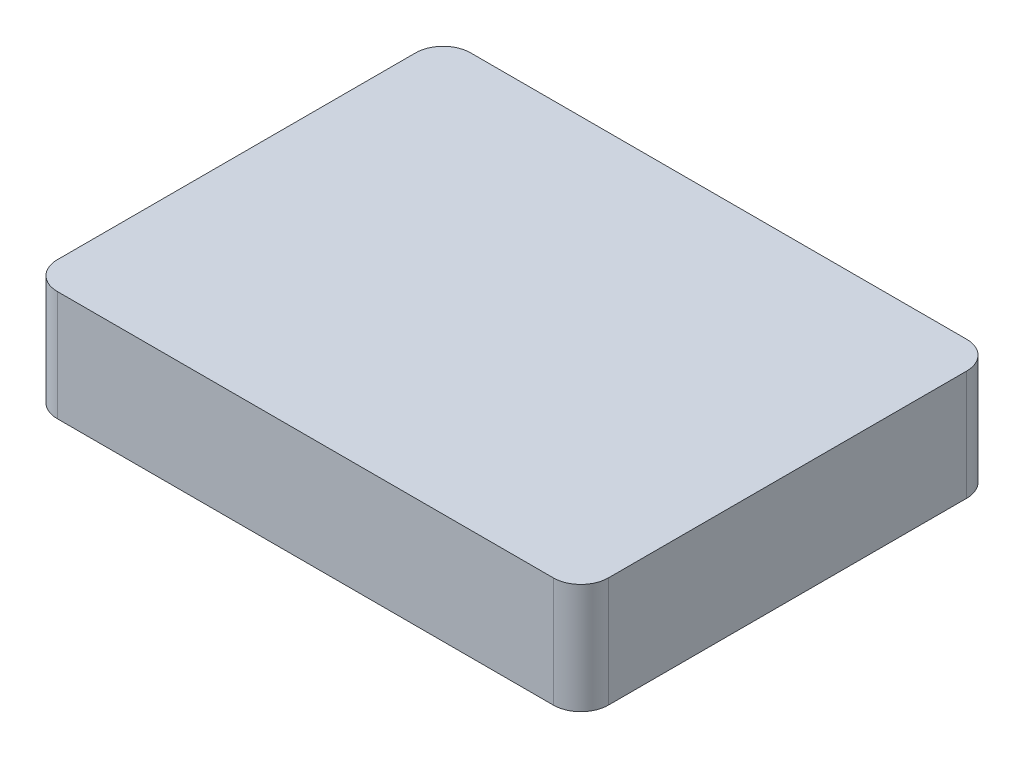
ISO-10303-21;
HEADER;
FILE_DESCRIPTION(('STEP AP214'),'2;1');
FILE_NAME('part.step','',(''),(''),'','','');
FILE_SCHEMA(('AUTOMOTIVE_DESIGN { 1 0 10303 214 1 1 1 1 }'));
ENDSEC;
DATA;
#1=APPLICATION_CONTEXT('core data for automotive mechanical design processes');
#2=APPLICATION_PROTOCOL_DEFINITION('international standard','automotive_design',2000,#1);
#3=PRODUCT_CONTEXT('',#1,'mechanical');
#4=PRODUCT('Part','Part','',(#3));
#5=PRODUCT_RELATED_PRODUCT_CATEGORY('part','',(#4));
#6=PRODUCT_DEFINITION_FORMATION('','',#4);
#7=PRODUCT_DEFINITION_CONTEXT('part definition',#1,'design');
#8=PRODUCT_DEFINITION('design','',#6,#7);
#9=PRODUCT_DEFINITION_SHAPE('','',#8);
#10=(LENGTH_UNIT() NAMED_UNIT(*) SI_UNIT(.MILLI.,.METRE.));
#11=(NAMED_UNIT(*) PLANE_ANGLE_UNIT() SI_UNIT($,.RADIAN.));
#12=(NAMED_UNIT(*) SI_UNIT($,.STERADIAN.) SOLID_ANGLE_UNIT());
#13=UNCERTAINTY_MEASURE_WITH_UNIT(LENGTH_MEASURE(1.E-05),#10,'distance_accuracy_value','');
#14=(GEOMETRIC_REPRESENTATION_CONTEXT(3) GLOBAL_UNCERTAINTY_ASSIGNED_CONTEXT((#13)) GLOBAL_UNIT_ASSIGNED_CONTEXT((#10,
#11,#12)) REPRESENTATION_CONTEXT('',''));
#15=CARTESIAN_POINT('',(0.,0.,0.));
#16=DIRECTION('',(0.,0.,1.));
#17=DIRECTION('',(1.,0.,0.));
#18=AXIS2_PLACEMENT_3D('',#15,#16,#17);
#19=CARTESIAN_POINT('',(0.,2.54,-9.525));
#20=DIRECTION('',(1.,0.,0.));
#21=DIRECTION('',(0.,0.,-1.));
#22=AXIS2_PLACEMENT_3D('',#19,#20,#21);
#23=PLANE('',#22);
#24=DIRECTION('',(0.,0.,1.));
#25=VECTOR('',#24,1.);
#26=CARTESIAN_POINT('',(0.,2.54,-9.525));
#27=LINE('',#26,#25);
#28=CARTESIAN_POINT('',(0.,2.54,-8.89));
#29=VERTEX_POINT('',#28);
#30=CARTESIAN_POINT('',(0.,2.54,-0.635000000000004));
#31=VERTEX_POINT('',#30);
#32=EDGE_CURVE('E161',#29,#31,#27,.T.);
#33=ORIENTED_EDGE('',*,*,#32,.F.);
#34=DIRECTION('',(0.,-1.,0.));
#35=VECTOR('',#34,1.);
#36=CARTESIAN_POINT('',(0.,2.54,-8.89));
#37=LINE('',#36,#35);
#38=CARTESIAN_POINT('',(0.,0.,-8.89));
#39=VERTEX_POINT('',#38);
#40=EDGE_CURVE('E186',#29,#39,#37,.T.);
#41=ORIENTED_EDGE('',*,*,#40,.T.);
#42=DIRECTION('',(0.,0.,1.));
#43=VECTOR('',#42,1.);
#44=CARTESIAN_POINT('',(0.,0.,-9.525));
#45=LINE('',#44,#43);
#46=CARTESIAN_POINT('',(0.,0.,-0.635000000000004));
#47=VERTEX_POINT('',#46);
#48=EDGE_CURVE('E174',#39,#47,#45,.T.);
#49=ORIENTED_EDGE('',*,*,#48,.T.);
#50=DIRECTION('',(0.,-1.,0.));
#51=VECTOR('',#50,1.);
#52=CARTESIAN_POINT('',(0.,2.54,-0.635));
#53=LINE('',#52,#51);
#54=EDGE_CURVE('E173',#47,#31,#53,.F.);
#55=ORIENTED_EDGE('',*,*,#54,.T.);
#56=EDGE_LOOP('',(#33,#41,#49,#55));
#57=FACE_BOUND('',#56,.T.);
#58=ADVANCED_FACE('F32',(#57),#23,.F.);
#59=CARTESIAN_POINT('',(0.,2.54,0.));
#60=DIRECTION('',(0.,0.,-1.));
#61=DIRECTION('',(-1.,0.,0.));
#62=AXIS2_PLACEMENT_3D('',#59,#60,#61);
#63=PLANE('',#62);
#64=DIRECTION('',(1.,0.,0.));
#65=VECTOR('',#64,1.);
#66=CARTESIAN_POINT('',(0.,0.,0.));
#67=LINE('',#66,#65);
#68=CARTESIAN_POINT('',(0.635,0.,0.));
#69=VERTEX_POINT('',#68);
#70=CARTESIAN_POINT('',(12.065,0.,0.));
#71=VERTEX_POINT('',#70);
#72=EDGE_CURVE('E177',#69,#71,#67,.T.);
#73=ORIENTED_EDGE('',*,*,#72,.T.);
#74=DIRECTION('',(0.,-1.,0.));
#75=VECTOR('',#74,1.);
#76=CARTESIAN_POINT('',(12.065,2.54,0.));
#77=LINE('',#76,#75);
#78=CARTESIAN_POINT('',(12.065,2.54,0.));
#79=VERTEX_POINT('',#78);
#80=EDGE_CURVE('E40',#71,#79,#77,.F.);
#81=ORIENTED_EDGE('',*,*,#80,.T.);
#82=DIRECTION('',(1.,0.,0.));
#83=VECTOR('',#82,1.);
#84=CARTESIAN_POINT('',(0.,2.54,0.));
#85=LINE('',#84,#83);
#86=CARTESIAN_POINT('',(0.635,2.54,0.));
#87=VERTEX_POINT('',#86);
#88=EDGE_CURVE('E164',#87,#79,#85,.T.);
#89=ORIENTED_EDGE('',*,*,#88,.F.);
#90=DIRECTION('',(0.,-1.,0.));
#91=VECTOR('',#90,1.);
#92=CARTESIAN_POINT('',(0.635,2.54,0.));
#93=LINE('',#92,#91);
#94=EDGE_CURVE('E214',#87,#69,#93,.T.);
#95=ORIENTED_EDGE('',*,*,#94,.T.);
#96=EDGE_LOOP('',(#73,#81,#89,#95));
#97=FACE_BOUND('',#96,.T.);
#98=ADVANCED_FACE('F219',(#97),#63,.F.);
#99=CARTESIAN_POINT('',(12.7,2.54,0.));
#100=DIRECTION('',(-1.,0.,0.));
#101=DIRECTION('',(0.,0.,1.));
#102=AXIS2_PLACEMENT_3D('',#99,#100,#101);
#103=PLANE('',#102);
#104=DIRECTION('',(0.,0.,-1.));
#105=VECTOR('',#104,1.);
#106=CARTESIAN_POINT('',(12.7,0.,0.));
#107=LINE('',#106,#105);
#108=CARTESIAN_POINT('',(12.7,0.,-0.635));
#109=VERTEX_POINT('',#108);
#110=CARTESIAN_POINT('',(12.7,0.,-8.89));
#111=VERTEX_POINT('',#110);
#112=EDGE_CURVE('E181',#109,#111,#107,.T.);
#113=ORIENTED_EDGE('',*,*,#112,.T.);
#114=DIRECTION('',(0.,-1.,0.));
#115=VECTOR('',#114,1.);
#116=CARTESIAN_POINT('',(12.7,2.54,-8.89));
#117=LINE('',#116,#115);
#118=CARTESIAN_POINT('',(12.7,2.54,-8.89));
#119=VERTEX_POINT('',#118);
#120=EDGE_CURVE('E55',#111,#119,#117,.F.);
#121=ORIENTED_EDGE('',*,*,#120,.T.);
#122=DIRECTION('',(0.,0.,-1.));
#123=VECTOR('',#122,1.);
#124=CARTESIAN_POINT('',(12.7,2.54,0.));
#125=LINE('',#124,#123);
#126=CARTESIAN_POINT('',(12.7,2.54,-0.635));
#127=VERTEX_POINT('',#126);
#128=EDGE_CURVE('E168',#127,#119,#125,.T.);
#129=ORIENTED_EDGE('',*,*,#128,.F.);
#130=DIRECTION('',(0.,-1.,0.));
#131=VECTOR('',#130,1.);
#132=CARTESIAN_POINT('',(12.7,2.54,-0.635));
#133=LINE('',#132,#131);
#134=EDGE_CURVE('E210',#127,#109,#133,.T.);
#135=ORIENTED_EDGE('',*,*,#134,.T.);
#136=EDGE_LOOP('',(#113,#121,#129,#135));
#137=FACE_BOUND('',#136,.T.);
#138=ADVANCED_FACE('F230',(#137),#103,.F.);
#139=CARTESIAN_POINT('',(12.7,2.54,-9.525));
#140=DIRECTION('',(0.,0.,1.));
#141=DIRECTION('',(1.,0.,0.));
#142=AXIS2_PLACEMENT_3D('',#139,#140,#141);
#143=PLANE('',#142);
#144=DIRECTION('',(-1.,0.,0.));
#145=VECTOR('',#144,1.);
#146=CARTESIAN_POINT('',(12.7,0.,-9.525));
#147=LINE('',#146,#145);
#148=CARTESIAN_POINT('',(12.065,0.,-9.525));
#149=VERTEX_POINT('',#148);
#150=CARTESIAN_POINT('',(0.634999999999995,0.,-9.525));
#151=VERTEX_POINT('',#150);
#152=EDGE_CURVE('E165',#149,#151,#147,.T.);
#153=ORIENTED_EDGE('',*,*,#152,.T.);
#154=DIRECTION('',(0.,-1.,0.));
#155=VECTOR('',#154,1.);
#156=CARTESIAN_POINT('',(0.634999999999995,2.54,-9.525));
#157=LINE('',#156,#155);
#158=CARTESIAN_POINT('',(0.634999999999995,2.54,-9.525));
#159=VERTEX_POINT('',#158);
#160=EDGE_CURVE('E200',#151,#159,#157,.F.);
#161=ORIENTED_EDGE('',*,*,#160,.T.);
#162=DIRECTION('',(-1.,0.,0.));
#163=VECTOR('',#162,1.);
#164=CARTESIAN_POINT('',(12.7,2.54,-9.525));
#165=LINE('',#164,#163);
#166=CARTESIAN_POINT('',(12.065,2.54,-9.525));
#167=VERTEX_POINT('',#166);
#168=EDGE_CURVE('E170',#167,#159,#165,.T.);
#169=ORIENTED_EDGE('',*,*,#168,.F.);
#170=DIRECTION('',(0.,-1.,0.));
#171=VECTOR('',#170,1.);
#172=CARTESIAN_POINT('',(12.065,2.54,-9.525));
#173=LINE('',#172,#171);
#174=EDGE_CURVE('E197',#167,#149,#173,.T.);
#175=ORIENTED_EDGE('',*,*,#174,.T.);
#176=EDGE_LOOP('',(#153,#161,#169,#175));
#177=FACE_BOUND('',#176,.T.);
#178=ADVANCED_FACE('F241',(#177),#143,.F.);
#179=CARTESIAN_POINT('',(0.,2.54,0.));
#180=DIRECTION('',(0.,1.,0.));
#181=DIRECTION('',(0.,0.,1.));
#182=AXIS2_PLACEMENT_3D('',#179,#180,#181);
#183=PLANE('',#182);
#184=ORIENTED_EDGE('',*,*,#168,.T.);
#185=CARTESIAN_POINT('',(0.634999999999995,2.54,-8.89));
#186=DIRECTION('',(0.,1.,0.));
#187=DIRECTION('',(0.,0.,1.));
#188=AXIS2_PLACEMENT_3D('',#185,#186,#187);
#189=CIRCLE('',#188,0.635);
#190=EDGE_CURVE('E208',#159,#29,#189,.T.);
#191=ORIENTED_EDGE('',*,*,#190,.T.);
#192=ORIENTED_EDGE('',*,*,#32,.T.);
#193=CARTESIAN_POINT('',(0.635,2.54,-0.635));
#194=DIRECTION('',(0.,1.,0.));
#195=DIRECTION('',(0.,0.,1.));
#196=AXIS2_PLACEMENT_3D('',#193,#194,#195);
#197=CIRCLE('',#196,0.635);
#198=EDGE_CURVE('E202',#31,#87,#197,.T.);
#199=ORIENTED_EDGE('',*,*,#198,.T.);
#200=ORIENTED_EDGE('',*,*,#88,.T.);
#201=CARTESIAN_POINT('',(12.065,2.54,-0.635));
#202=DIRECTION('',(0.,1.,0.));
#203=DIRECTION('',(0.,0.,1.));
#204=AXIS2_PLACEMENT_3D('',#201,#202,#203);
#205=CIRCLE('',#204,0.635);
#206=EDGE_CURVE('E204',#79,#127,#205,.T.);
#207=ORIENTED_EDGE('',*,*,#206,.T.);
#208=ORIENTED_EDGE('',*,*,#128,.T.);
#209=CARTESIAN_POINT('',(12.065,2.54,-8.89));
#210=DIRECTION('',(0.,1.,0.));
#211=DIRECTION('',(0.,0.,1.));
#212=AXIS2_PLACEMENT_3D('',#209,#210,#211);
#213=CIRCLE('',#212,0.635);
#214=EDGE_CURVE('E206',#119,#167,#213,.T.);
#215=ORIENTED_EDGE('',*,*,#214,.T.);
#216=EDGE_LOOP('',(#184,#191,#192,#199,#200,#207,#208,#215));
#217=FACE_BOUND('',#216,.T.);
#218=ADVANCED_FACE('F225',(#217),#183,.T.);
#219=CARTESIAN_POINT('',(0.,0.,0.));
#220=DIRECTION('',(0.,1.,0.));
#221=DIRECTION('',(0.,0.,1.));
#222=AXIS2_PLACEMENT_3D('',#219,#220,#221);
#223=PLANE('',#222);
#224=DIRECTION('',(-1.,0.,0.));
#225=VECTOR('',#224,1.);
#226=CARTESIAN_POINT('',(12.7,0.,-8.89));
#227=LINE('',#226,#225);
#228=CARTESIAN_POINT('',(12.065,0.,-8.89));
#229=VERTEX_POINT('',#228);
#230=CARTESIAN_POINT('',(0.634999999999995,0.,-8.89));
#231=VERTEX_POINT('',#230);
#232=EDGE_CURVE('E133',#229,#231,#227,.T.);
#233=ORIENTED_EDGE('',*,*,#232,.T.);
#234=DIRECTION('',(0.,0.,1.));
#235=VECTOR('',#234,1.);
#236=CARTESIAN_POINT('',(0.634999999999995,0.,-9.525));
#237=LINE('',#236,#235);
#238=CARTESIAN_POINT('',(0.635,0.,-0.635));
#239=VERTEX_POINT('',#238);
#240=EDGE_CURVE('E139',#231,#239,#237,.T.);
#241=ORIENTED_EDGE('',*,*,#240,.T.);
#242=DIRECTION('',(1.,0.,0.));
#243=VECTOR('',#242,1.);
#244=CARTESIAN_POINT('',(0.,0.,-0.635));
#245=LINE('',#244,#243);
#246=CARTESIAN_POINT('',(12.065,0.,-0.635));
#247=VERTEX_POINT('',#246);
#248=EDGE_CURVE('E155',#239,#247,#245,.T.);
#249=ORIENTED_EDGE('',*,*,#248,.T.);
#250=DIRECTION('',(0.,0.,-1.));
#251=VECTOR('',#250,1.);
#252=CARTESIAN_POINT('',(12.065,0.,0.));
#253=LINE('',#252,#251);
#254=EDGE_CURVE('E47',#247,#229,#253,.T.);
#255=ORIENTED_EDGE('',*,*,#254,.T.);
#256=EDGE_LOOP('',(#233,#241,#249,#255));
#257=FACE_BOUND('',#256,.T.);
#258=ORIENTED_EDGE('',*,*,#48,.F.);
#259=CARTESIAN_POINT('',(0.634999999999995,0.,-8.89));
#260=DIRECTION('',(0.,1.,0.));
#261=DIRECTION('',(0.,0.,1.));
#262=AXIS2_PLACEMENT_3D('',#259,#260,#261);
#263=CIRCLE('',#262,0.635);
#264=EDGE_CURVE('E195',#39,#151,#263,.F.);
#265=ORIENTED_EDGE('',*,*,#264,.T.);
#266=ORIENTED_EDGE('',*,*,#152,.F.);
#267=CARTESIAN_POINT('',(12.065,0.,-8.89));
#268=DIRECTION('',(0.,1.,0.));
#269=DIRECTION('',(0.,0.,1.));
#270=AXIS2_PLACEMENT_3D('',#267,#268,#269);
#271=CIRCLE('',#270,0.635);
#272=EDGE_CURVE('E193',#149,#111,#271,.F.);
#273=ORIENTED_EDGE('',*,*,#272,.T.);
#274=ORIENTED_EDGE('',*,*,#112,.F.);
#275=CARTESIAN_POINT('',(12.065,0.,-0.635));
#276=DIRECTION('',(0.,1.,0.));
#277=DIRECTION('',(0.,0.,1.));
#278=AXIS2_PLACEMENT_3D('',#275,#276,#277);
#279=CIRCLE('',#278,0.635);
#280=EDGE_CURVE('E191',#109,#71,#279,.F.);
#281=ORIENTED_EDGE('',*,*,#280,.T.);
#282=ORIENTED_EDGE('',*,*,#72,.F.);
#283=CARTESIAN_POINT('',(0.635,0.,-0.635));
#284=DIRECTION('',(0.,1.,0.));
#285=DIRECTION('',(0.,0.,1.));
#286=AXIS2_PLACEMENT_3D('',#283,#284,#285);
#287=CIRCLE('',#286,0.635);
#288=EDGE_CURVE('E189',#69,#47,#287,.F.);
#289=ORIENTED_EDGE('',*,*,#288,.T.);
#290=EDGE_LOOP('',(#258,#265,#266,#273,#274,#281,#282,#289));
#291=FACE_BOUND('',#290,.T.);
#292=ADVANCED_FACE('F233',(#257,#291),#223,.F.);
#293=CARTESIAN_POINT('',(0.634999999999995,2.54,-8.89));
#294=DIRECTION('',(0.,-1.,0.));
#295=DIRECTION('',(0.,0.,-1.));
#296=AXIS2_PLACEMENT_3D('',#293,#294,#295);
#297=CYLINDRICAL_SURFACE('',#296,0.635);
#298=ORIENTED_EDGE('',*,*,#190,.F.);
#299=ORIENTED_EDGE('',*,*,#160,.F.);
#300=ORIENTED_EDGE('',*,*,#264,.F.);
#301=ORIENTED_EDGE('',*,*,#40,.F.);
#302=EDGE_LOOP('',(#298,#299,#300,#301));
#303=FACE_BOUND('',#302,.T.);
#304=ADVANCED_FACE('F247',(#303),#297,.T.);
#305=CARTESIAN_POINT('',(12.065,2.54,-8.89));
#306=DIRECTION('',(0.,-1.,0.));
#307=DIRECTION('',(0.,0.,-1.));
#308=AXIS2_PLACEMENT_3D('',#305,#306,#307);
#309=CYLINDRICAL_SURFACE('',#308,0.635);
#310=ORIENTED_EDGE('',*,*,#214,.F.);
#311=ORIENTED_EDGE('',*,*,#120,.F.);
#312=ORIENTED_EDGE('',*,*,#272,.F.);
#313=ORIENTED_EDGE('',*,*,#174,.F.);
#314=EDGE_LOOP('',(#310,#311,#312,#313));
#315=FACE_BOUND('',#314,.T.);
#316=ADVANCED_FACE('F238',(#315),#309,.T.);
#317=CARTESIAN_POINT('',(12.065,2.54,-0.635));
#318=DIRECTION('',(0.,-1.,0.));
#319=DIRECTION('',(0.,0.,-1.));
#320=AXIS2_PLACEMENT_3D('',#317,#318,#319);
#321=CYLINDRICAL_SURFACE('',#320,0.635);
#322=ORIENTED_EDGE('',*,*,#206,.F.);
#323=ORIENTED_EDGE('',*,*,#80,.F.);
#324=ORIENTED_EDGE('',*,*,#280,.F.);
#325=ORIENTED_EDGE('',*,*,#134,.F.);
#326=EDGE_LOOP('',(#322,#323,#324,#325));
#327=FACE_BOUND('',#326,.T.);
#328=ADVANCED_FACE('F228',(#327),#321,.T.);
#329=CARTESIAN_POINT('',(0.635,2.54,-0.635));
#330=DIRECTION('',(0.,-1.,0.));
#331=DIRECTION('',(0.,0.,-1.));
#332=AXIS2_PLACEMENT_3D('',#329,#330,#331);
#333=CYLINDRICAL_SURFACE('',#332,0.635);
#334=ORIENTED_EDGE('',*,*,#198,.F.);
#335=ORIENTED_EDGE('',*,*,#54,.F.);
#336=ORIENTED_EDGE('',*,*,#288,.F.);
#337=ORIENTED_EDGE('',*,*,#94,.F.);
#338=EDGE_LOOP('',(#334,#335,#336,#337));
#339=FACE_BOUND('',#338,.T.);
#340=ADVANCED_FACE('F34',(#339),#333,.T.);
#341=CARTESIAN_POINT('',(0.634999999999995,2.54,-9.525));
#342=DIRECTION('',(1.,0.,0.));
#343=DIRECTION('',(0.,0.,-1.));
#344=AXIS2_PLACEMENT_3D('',#341,#342,#343);
#345=PLANE('',#344);
#346=DIRECTION('',(0.,0.,1.));
#347=VECTOR('',#346,1.);
#348=CARTESIAN_POINT('',(0.634999999999995,1.905,-9.525));
#349=LINE('',#348,#347);
#350=CARTESIAN_POINT('',(0.634999999999995,1.905,-8.89));
#351=VERTEX_POINT('',#350);
#352=CARTESIAN_POINT('',(0.635,1.905,-0.635));
#353=VERTEX_POINT('',#352);
#354=EDGE_CURVE('E123',#351,#353,#349,.T.);
#355=ORIENTED_EDGE('',*,*,#354,.T.);
#356=DIRECTION('',(0.,1.,0.));
#357=VECTOR('',#356,1.);
#358=CARTESIAN_POINT('',(0.635,2.54,-0.635));
#359=LINE('',#358,#357);
#360=EDGE_CURVE('E144',#239,#353,#359,.T.);
#361=ORIENTED_EDGE('',*,*,#360,.F.);
#362=ORIENTED_EDGE('',*,*,#240,.F.);
#363=DIRECTION('',(0.,1.,0.));
#364=VECTOR('',#363,1.);
#365=CARTESIAN_POINT('',(0.634999999999995,2.54,-8.89));
#366=LINE('',#365,#364);
#367=EDGE_CURVE('E136',#231,#351,#366,.T.);
#368=ORIENTED_EDGE('',*,*,#367,.T.);
#369=EDGE_LOOP('',(#355,#361,#362,#368));
#370=FACE_BOUND('',#369,.T.);
#371=ADVANCED_FACE('F137',(#370),#345,.T.);
#372=CARTESIAN_POINT('',(0.,2.54,-0.635));
#373=DIRECTION('',(0.,0.,-1.));
#374=DIRECTION('',(-1.,0.,0.));
#375=AXIS2_PLACEMENT_3D('',#372,#373,#374);
#376=PLANE('',#375);
#377=ORIENTED_EDGE('',*,*,#248,.F.);
#378=ORIENTED_EDGE('',*,*,#360,.T.);
#379=DIRECTION('',(1.,0.,0.));
#380=VECTOR('',#379,1.);
#381=CARTESIAN_POINT('',(0.,1.905,-0.635));
#382=LINE('',#381,#380);
#383=CARTESIAN_POINT('',(12.065,1.905,-0.635));
#384=VERTEX_POINT('',#383);
#385=EDGE_CURVE('E130',#353,#384,#382,.T.);
#386=ORIENTED_EDGE('',*,*,#385,.T.);
#387=DIRECTION('',(0.,1.,0.));
#388=VECTOR('',#387,1.);
#389=CARTESIAN_POINT('',(12.065,2.54,-0.635));
#390=LINE('',#389,#388);
#391=EDGE_CURVE('E178',#247,#384,#390,.T.);
#392=ORIENTED_EDGE('',*,*,#391,.F.);
#393=EDGE_LOOP('',(#377,#378,#386,#392));
#394=FACE_BOUND('',#393,.T.);
#395=ADVANCED_FACE('F256',(#394),#376,.T.);
#396=CARTESIAN_POINT('',(12.065,2.54,0.));
#397=DIRECTION('',(-1.,0.,0.));
#398=DIRECTION('',(0.,0.,1.));
#399=AXIS2_PLACEMENT_3D('',#396,#397,#398);
#400=PLANE('',#399);
#401=ORIENTED_EDGE('',*,*,#254,.F.);
#402=ORIENTED_EDGE('',*,*,#391,.T.);
#403=DIRECTION('',(0.,0.,-1.));
#404=VECTOR('',#403,1.);
#405=CARTESIAN_POINT('',(12.065,1.905,0.));
#406=LINE('',#405,#404);
#407=CARTESIAN_POINT('',(12.065,1.905,-8.89));
#408=VERTEX_POINT('',#407);
#409=EDGE_CURVE('E148',#384,#408,#406,.T.);
#410=ORIENTED_EDGE('',*,*,#409,.T.);
#411=DIRECTION('',(0.,1.,0.));
#412=VECTOR('',#411,1.);
#413=CARTESIAN_POINT('',(12.065,2.54,-8.89));
#414=LINE('',#413,#412);
#415=EDGE_CURVE('E143',#229,#408,#414,.T.);
#416=ORIENTED_EDGE('',*,*,#415,.F.);
#417=EDGE_LOOP('',(#401,#402,#410,#416));
#418=FACE_BOUND('',#417,.T.);
#419=ADVANCED_FACE('F308',(#418),#400,.T.);
#420=CARTESIAN_POINT('',(12.7,2.54,-8.89));
#421=DIRECTION('',(0.,0.,1.));
#422=DIRECTION('',(1.,0.,0.));
#423=AXIS2_PLACEMENT_3D('',#420,#421,#422);
#424=PLANE('',#423);
#425=ORIENTED_EDGE('',*,*,#232,.F.);
#426=ORIENTED_EDGE('',*,*,#415,.T.);
#427=DIRECTION('',(-1.,0.,0.));
#428=VECTOR('',#427,1.);
#429=CARTESIAN_POINT('',(12.7,1.905,-8.89));
#430=LINE('',#429,#428);
#431=EDGE_CURVE('E127',#408,#351,#430,.T.);
#432=ORIENTED_EDGE('',*,*,#431,.T.);
#433=ORIENTED_EDGE('',*,*,#367,.F.);
#434=EDGE_LOOP('',(#425,#426,#432,#433));
#435=FACE_BOUND('',#434,.T.);
#436=ADVANCED_FACE('F146',(#435),#424,.T.);
#437=CARTESIAN_POINT('',(0.,1.905,0.));
#438=DIRECTION('',(0.,1.,0.));
#439=DIRECTION('',(0.,0.,1.));
#440=AXIS2_PLACEMENT_3D('',#437,#438,#439);
#441=PLANE('',#440);
#442=CARTESIAN_POINT('',(6.35,1.905,-4.7625));
#443=DIRECTION('',(0.,1.,0.));
#444=DIRECTION('',(0.,0.,1.));
#445=AXIS2_PLACEMENT_3D('',#442,#443,#444);
#446=CIRCLE('',#445,2.54);
#447=CARTESIAN_POINT('',(6.35,1.905,-2.2225));
#448=VERTEX_POINT('',#447);
#449=EDGE_CURVE('E11',#448,#448,#446,.F.);
#450=ORIENTED_EDGE('',*,*,#449,.F.);
#451=EDGE_LOOP('',(#450));
#452=FACE_BOUND('',#451,.T.);
#453=ORIENTED_EDGE('',*,*,#431,.F.);
#454=ORIENTED_EDGE('',*,*,#409,.F.);
#455=ORIENTED_EDGE('',*,*,#385,.F.);
#456=ORIENTED_EDGE('',*,*,#354,.F.);
#457=EDGE_LOOP('',(#453,#454,#455,#456));
#458=FACE_BOUND('',#457,.T.);
#459=ADVANCED_FACE('F125',(#452,#458),#441,.F.);
#460=CARTESIAN_POINT('',(6.35,-7.18420489685532,-4.7625));
#461=DIRECTION('',(0.,1.,0.));
#462=DIRECTION('',(0.,0.,1.));
#463=AXIS2_PLACEMENT_3D('',#460,#461,#462);
#464=CYLINDRICAL_SURFACE('',#463,2.54);
#465=CARTESIAN_POINT('',(6.35,0.,-4.7625));
#466=DIRECTION('',(0.,1.,0.));
#467=DIRECTION('',(0.,0.,1.));
#468=AXIS2_PLACEMENT_3D('',#465,#466,#467);
#469=CIRCLE('',#468,2.54);
#470=CARTESIAN_POINT('',(6.35,0.,-2.2225));
#471=VERTEX_POINT('',#470);
#472=EDGE_CURVE('E156',#471,#471,#469,.T.);
#473=CARTESIAN_POINT('',(6.35,0.,-2.2225));
#474=CARTESIAN_POINT('',(6.35,0.0198437499999991,-2.2225));
#475=CARTESIAN_POINT('',(6.35,0.0396874999999989,-2.2225));
#476=CARTESIAN_POINT('',(6.35,0.079374999999999,-2.2225));
#477=CARTESIAN_POINT('',(6.35,0.0992187499999992,-2.2225));
#478=CARTESIAN_POINT('',(6.35,0.138906249999999,-2.2225));
#479=CARTESIAN_POINT('',(6.35,0.158749999999999,-2.2225));
#480=CARTESIAN_POINT('',(6.35,0.198437499999999,-2.2225));
#481=CARTESIAN_POINT('',(6.35,0.218281249999999,-2.2225));
#482=CARTESIAN_POINT('',(6.35,0.25796875,-2.2225));
#483=CARTESIAN_POINT('',(6.35,0.277812499999999,-2.2225));
#484=CARTESIAN_POINT('',(6.35,0.317499999999999,-2.2225));
#485=CARTESIAN_POINT('',(6.35,0.337343749999999,-2.2225));
#486=CARTESIAN_POINT('',(6.35,0.377031249999999,-2.2225));
#487=CARTESIAN_POINT('',(6.35,0.396874999999999,-2.2225));
#488=CARTESIAN_POINT('',(6.35,0.436562499999999,-2.2225));
#489=CARTESIAN_POINT('',(6.35,0.456406249999999,-2.2225));
#490=CARTESIAN_POINT('',(6.35,0.496093749999999,-2.2225));
#491=CARTESIAN_POINT('',(6.35,0.515937499999999,-2.2225));
#492=CARTESIAN_POINT('',(6.35,0.555624999999999,-2.2225));
#493=CARTESIAN_POINT('',(6.35,0.575468749999999,-2.2225));
#494=CARTESIAN_POINT('',(6.35,0.615156249999999,-2.2225));
#495=CARTESIAN_POINT('',(6.35,0.634999999999999,-2.2225));
#496=CARTESIAN_POINT('',(6.35,0.674687499999998,-2.2225));
#497=CARTESIAN_POINT('',(6.35,0.694531249999998,-2.2225));
#498=CARTESIAN_POINT('',(6.35,0.734218749999998,-2.2225));
#499=CARTESIAN_POINT('',(6.35,0.754062499999998,-2.2225));
#500=CARTESIAN_POINT('',(6.35,0.793749999999998,-2.2225));
#501=CARTESIAN_POINT('',(6.35,0.813593749999999,-2.2225));
#502=CARTESIAN_POINT('',(6.35,0.853281249999999,-2.2225));
#503=CARTESIAN_POINT('',(6.35,0.873124999999999,-2.2225));
#504=CARTESIAN_POINT('',(6.35,0.912812499999999,-2.2225));
#505=CARTESIAN_POINT('',(6.35,0.932656249999999,-2.2225));
#506=CARTESIAN_POINT('',(6.35,0.972343749999998,-2.2225));
#507=CARTESIAN_POINT('',(6.35,0.992187499999998,-2.2225));
#508=CARTESIAN_POINT('',(6.35,1.031875,-2.2225));
#509=CARTESIAN_POINT('',(6.35,1.05171875,-2.2225));
#510=CARTESIAN_POINT('',(6.35,1.09140625,-2.2225));
#511=CARTESIAN_POINT('',(6.35,1.11125,-2.2225));
#512=CARTESIAN_POINT('',(6.35,1.1509375,-2.2225));
#513=CARTESIAN_POINT('',(6.35,1.17078125,-2.2225));
#514=CARTESIAN_POINT('',(6.35,1.21046875,-2.2225));
#515=CARTESIAN_POINT('',(6.35,1.2303125,-2.2225));
#516=CARTESIAN_POINT('',(6.35,1.27,-2.2225));
#517=CARTESIAN_POINT('',(6.35,1.28984375,-2.2225));
#518=CARTESIAN_POINT('',(6.35,1.32953125,-2.2225));
#519=CARTESIAN_POINT('',(6.35,1.349375,-2.2225));
#520=CARTESIAN_POINT('',(6.35,1.3890625,-2.2225));
#521=CARTESIAN_POINT('',(6.35,1.40890625,-2.2225));
#522=CARTESIAN_POINT('',(6.35,1.44859375,-2.2225));
#523=CARTESIAN_POINT('',(6.35,1.4684375,-2.2225));
#524=CARTESIAN_POINT('',(6.35,1.508125,-2.2225));
#525=CARTESIAN_POINT('',(6.35,1.52796875,-2.2225));
#526=CARTESIAN_POINT('',(6.35,1.56765625,-2.2225));
#527=CARTESIAN_POINT('',(6.35,1.5875,-2.2225));
#528=CARTESIAN_POINT('',(6.35,1.6271875,-2.2225));
#529=CARTESIAN_POINT('',(6.35,1.64703125,-2.2225));
#530=CARTESIAN_POINT('',(6.35,1.68671875,-2.2225));
#531=CARTESIAN_POINT('',(6.35,1.7065625,-2.2225));
#532=CARTESIAN_POINT('',(6.35,1.74625,-2.2225));
#533=CARTESIAN_POINT('',(6.35,1.76609375,-2.2225));
#534=CARTESIAN_POINT('',(6.35,1.80578125,-2.2225));
#535=CARTESIAN_POINT('',(6.35,1.825625,-2.2225));
#536=CARTESIAN_POINT('',(6.35,1.8653125,-2.2225));
#537=CARTESIAN_POINT('',(6.35,1.88515625,-2.2225));
#538=CARTESIAN_POINT('',(6.35,1.905,-2.2225));
#539=B_SPLINE_CURVE_WITH_KNOTS('',3,(#473,#474,#475,#476,#477,#478,#479,#480,#481,#482,#483,
#484,#485,#486,#487,#488,#489,#490,#491,#492,#493,#494,#495,#496,#497,#498,#499,#500,#501,#502,
#503,#504,#505,#506,#507,#508,#509,#510,#511,#512,#513,#514,#515,#516,#517,#518,#519,#520,#521,
#522,#523,#524,#525,#526,#527,#528,#529,#530,#531,#532,#533,#534,#535,#536,#537,#538),
.UNSPECIFIED.,.F.,.F.,(4,2,2,2,2,2,2,2,2,2,2,2,2,2,2,2,2,2,2,2,2,2,2,2,2,2,2,2,2,2,2,2,4),(0.,
0.0595312499999997,0.1190625,0.17859375,0.238125,0.29765625,0.3571875,0.41671875,0.47625,
0.53578125,0.5953125,0.654843749999999,0.714374999999999,0.773906249999999,0.8334375,0.89296875,
0.952499999999999,1.01203125,1.0715625,1.13109375,1.190625,1.25015625,1.3096875,1.36921875,
1.42875,1.48828125,1.5478125,1.60734375,1.666875,1.72640625,1.7859375,1.84546875,1.905),.UNSPECIFIED.);
#540=EDGE_CURVE('BSEAM334',#471,#448,#539,.T.);
#541=ORIENTED_EDGE('',*,*,#472,.T.);
#542=ORIENTED_EDGE('',*,*,#449,.T.);
#543=ORIENTED_EDGE('',*,*,#540,.T.);
#544=ORIENTED_EDGE('',*,*,#540,.F.);
#545=EDGE_LOOP('',(#541,#543,#542,#544));
#546=FACE_BOUND('',#545,.T.);
#547=ADVANCED_FACE('F334',(#546),#464,.T.);
#548=CARTESIAN_POINT('',(0.,0.,0.));
#549=DIRECTION('',(0.,1.,0.));
#550=DIRECTION('',(0.,0.,1.));
#551=AXIS2_PLACEMENT_3D('',#548,#549,#550);
#552=PLANE('',#551);
#553=ORIENTED_EDGE('',*,*,#472,.F.);
#554=EDGE_LOOP('',(#553));
#555=FACE_BOUND('',#554,.T.);
#556=ADVANCED_FACE('F344',(#555),#552,.F.);
#557=CLOSED_SHELL('',(#58,#98,#138,#178,#218,#292,#304,#316,#328,#340,#371,#395,#419,#436,#459,
#547,#556));
#558=MANIFOLD_SOLID_BREP('B2',#557);
#559=ADVANCED_BREP_SHAPE_REPRESENTATION('',(#18,#558),#14);
#560=SHAPE_DEFINITION_REPRESENTATION(#9,#559);
ENDSEC;
END-ISO-10303-21;
